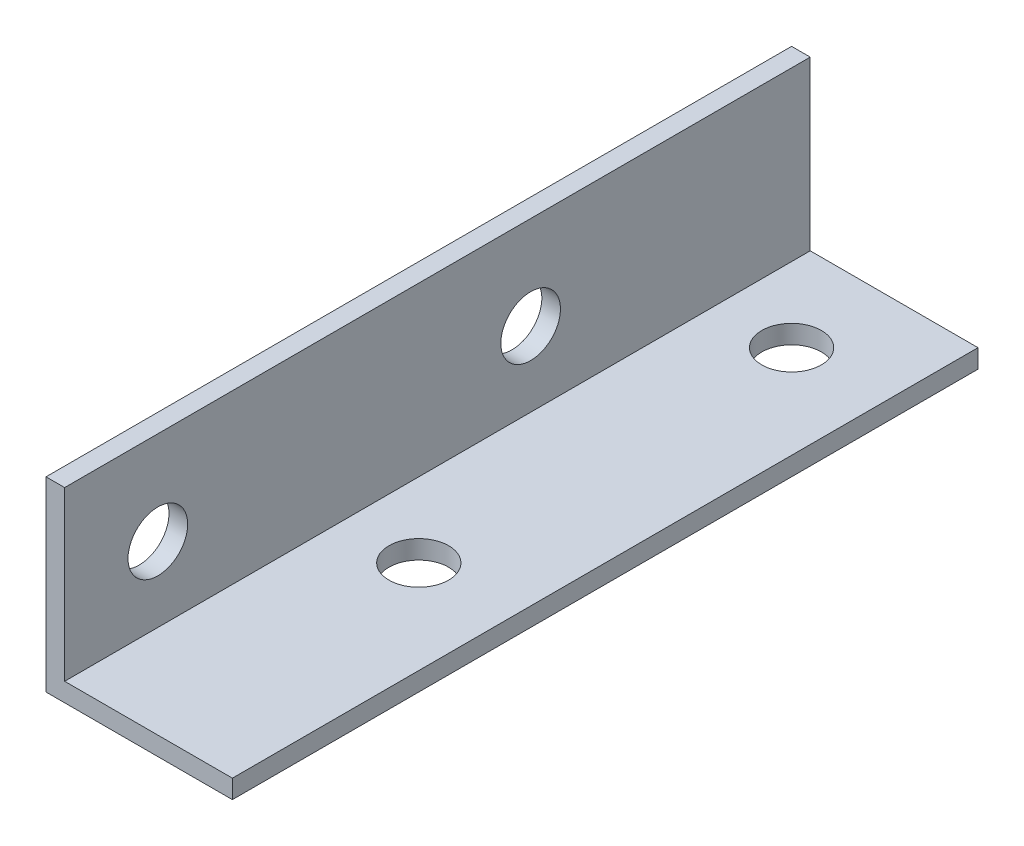
ISO-10303-21;
HEADER;
FILE_DESCRIPTION(('STEP AP214'),'2;1');
FILE_NAME('part.step','',(''),(''),'','','');
FILE_SCHEMA(('AUTOMOTIVE_DESIGN { 1 0 10303 214 1 1 1 1 }'));
ENDSEC;
DATA;
#1=APPLICATION_CONTEXT('core data for automotive mechanical design processes');
#2=APPLICATION_PROTOCOL_DEFINITION('international standard','automotive_design',2000,#1);
#3=PRODUCT_CONTEXT('',#1,'mechanical');
#4=PRODUCT('Part','Part','',(#3));
#5=PRODUCT_RELATED_PRODUCT_CATEGORY('part','',(#4));
#6=PRODUCT_DEFINITION_FORMATION('','',#4);
#7=PRODUCT_DEFINITION_CONTEXT('part definition',#1,'design');
#8=PRODUCT_DEFINITION('design','',#6,#7);
#9=PRODUCT_DEFINITION_SHAPE('','',#8);
#10=(LENGTH_UNIT() NAMED_UNIT(*) SI_UNIT(.MILLI.,.METRE.));
#11=(NAMED_UNIT(*) PLANE_ANGLE_UNIT() SI_UNIT($,.RADIAN.));
#12=(NAMED_UNIT(*) SI_UNIT($,.STERADIAN.) SOLID_ANGLE_UNIT());
#13=UNCERTAINTY_MEASURE_WITH_UNIT(LENGTH_MEASURE(1.E-05),#10,'distance_accuracy_value','');
#14=(GEOMETRIC_REPRESENTATION_CONTEXT(3) GLOBAL_UNCERTAINTY_ASSIGNED_CONTEXT((#13)) GLOBAL_UNIT_ASSIGNED_CONTEXT((#10,
#11,#12)) REPRESENTATION_CONTEXT('',''));
#15=CARTESIAN_POINT('',(0.,0.,0.));
#16=DIRECTION('',(0.,0.,1.));
#17=DIRECTION('',(1.,0.,0.));
#18=AXIS2_PLACEMENT_3D('',#15,#16,#17);
#19=CARTESIAN_POINT('',(-5.,-5.,40.));
#20=DIRECTION('',(1.,0.,0.));
#21=DIRECTION('',(0.,0.,-1.));
#22=AXIS2_PLACEMENT_3D('',#19,#20,#21);
#23=PLANE('',#22);
#24=CARTESIAN_POINT('',(-5.,0.,15.));
#25=DIRECTION('',(-1.,0.,0.));
#26=DIRECTION('',(0.,0.,1.));
#27=AXIS2_PLACEMENT_3D('',#24,#25,#26);
#28=CIRCLE('',#27,1.6);
#29=CARTESIAN_POINT('',(-5.,0.,16.6));
#30=VERTEX_POINT('',#29);
#31=EDGE_CURVE('E144',#30,#30,#28,.T.);
#32=ORIENTED_EDGE('',*,*,#31,.F.);
#33=EDGE_LOOP('',(#32));
#34=FACE_BOUND('',#33,.T.);
#35=CARTESIAN_POINT('',(-5.,0.,35.));
#36=DIRECTION('',(-1.,0.,0.));
#37=DIRECTION('',(0.,0.,1.));
#38=AXIS2_PLACEMENT_3D('',#35,#36,#37);
#39=CIRCLE('',#38,1.6);
#40=CARTESIAN_POINT('',(-5.,0.,36.6));
#41=VERTEX_POINT('',#40);
#42=EDGE_CURVE('E149',#41,#41,#39,.T.);
#43=ORIENTED_EDGE('',*,*,#42,.F.);
#44=EDGE_LOOP('',(#43));
#45=FACE_BOUND('',#44,.T.);
#46=DIRECTION('',(0.,-1.,0.));
#47=VECTOR('',#46,1.);
#48=CARTESIAN_POINT('',(-5.,-5.,0.));
#49=LINE('',#48,#47);
#50=CARTESIAN_POINT('',(-5.,5.,0.));
#51=VERTEX_POINT('',#50);
#52=CARTESIAN_POINT('',(-5.,-5.,0.));
#53=VERTEX_POINT('',#52);
#54=EDGE_CURVE('E119',#51,#53,#49,.T.);
#55=ORIENTED_EDGE('',*,*,#54,.T.);
#56=DIRECTION('',(0.,0.,-1.));
#57=VECTOR('',#56,1.);
#58=CARTESIAN_POINT('',(-5.,-5.,40.));
#59=LINE('',#58,#57);
#60=CARTESIAN_POINT('',(-5.,-5.,40.));
#61=VERTEX_POINT('',#60);
#62=EDGE_CURVE('E11',#61,#53,#59,.T.);
#63=ORIENTED_EDGE('',*,*,#62,.F.);
#64=DIRECTION('',(0.,-1.,0.));
#65=VECTOR('',#64,1.);
#66=CARTESIAN_POINT('',(-5.,-5.,40.));
#67=LINE('',#66,#65);
#68=CARTESIAN_POINT('',(-5.,5.,40.));
#69=VERTEX_POINT('',#68);
#70=EDGE_CURVE('E130',#69,#61,#67,.T.);
#71=ORIENTED_EDGE('',*,*,#70,.F.);
#72=DIRECTION('',(0.,0.,-1.));
#73=VECTOR('',#72,1.);
#74=CARTESIAN_POINT('',(-5.,5.,40.));
#75=LINE('',#74,#73);
#76=EDGE_CURVE('E115',#69,#51,#75,.T.);
#77=ORIENTED_EDGE('',*,*,#76,.T.);
#78=EDGE_LOOP('',(#55,#63,#71,#77));
#79=FACE_BOUND('',#78,.T.);
#80=ADVANCED_FACE('F33',(#34,#45,#79),#23,.F.);
#81=CARTESIAN_POINT('',(5.,-5.,40.));
#82=DIRECTION('',(0.,1.,0.));
#83=DIRECTION('',(-1.,0.,0.));
#84=AXIS2_PLACEMENT_3D('',#81,#82,#83);
#85=PLANE('',#84);
#86=CARTESIAN_POINT('',(0.,-5.,5.));
#87=DIRECTION('',(0.,1.,0.));
#88=DIRECTION('',(-1.,0.,0.));
#89=AXIS2_PLACEMENT_3D('',#86,#87,#88);
#90=CIRCLE('',#89,1.6);
#91=CARTESIAN_POINT('',(-1.6,-5.,5.));
#92=VERTEX_POINT('',#91);
#93=EDGE_CURVE('E123',#92,#92,#90,.T.);
#94=ORIENTED_EDGE('',*,*,#93,.T.);
#95=EDGE_LOOP('',(#94));
#96=FACE_BOUND('',#95,.T.);
#97=CARTESIAN_POINT('',(0.,-5.,25.));
#98=DIRECTION('',(0.,1.,0.));
#99=DIRECTION('',(-1.,0.,0.));
#100=AXIS2_PLACEMENT_3D('',#97,#98,#99);
#101=CIRCLE('',#100,1.6);
#102=CARTESIAN_POINT('',(-1.6,-5.,25.));
#103=VERTEX_POINT('',#102);
#104=EDGE_CURVE('E139',#103,#103,#101,.T.);
#105=ORIENTED_EDGE('',*,*,#104,.T.);
#106=EDGE_LOOP('',(#105));
#107=FACE_BOUND('',#106,.T.);
#108=DIRECTION('',(1.,0.,0.));
#109=VECTOR('',#108,1.);
#110=CARTESIAN_POINT('',(5.,-5.,0.));
#111=LINE('',#110,#109);
#112=CARTESIAN_POINT('',(5.,-5.,0.));
#113=VERTEX_POINT('',#112);
#114=EDGE_CURVE('E122',#53,#113,#111,.T.);
#115=ORIENTED_EDGE('',*,*,#114,.T.);
#116=DIRECTION('',(0.,0.,-1.));
#117=VECTOR('',#116,1.);
#118=CARTESIAN_POINT('',(5.,-5.,40.));
#119=LINE('',#118,#117);
#120=CARTESIAN_POINT('',(5.,-5.,40.));
#121=VERTEX_POINT('',#120);
#122=EDGE_CURVE('E42',#121,#113,#119,.T.);
#123=ORIENTED_EDGE('',*,*,#122,.F.);
#124=DIRECTION('',(1.,0.,0.));
#125=VECTOR('',#124,1.);
#126=CARTESIAN_POINT('',(5.,-5.,40.));
#127=LINE('',#126,#125);
#128=EDGE_CURVE('E88',#61,#121,#127,.T.);
#129=ORIENTED_EDGE('',*,*,#128,.F.);
#130=ORIENTED_EDGE('',*,*,#62,.T.);
#131=EDGE_LOOP('',(#115,#123,#129,#130));
#132=FACE_BOUND('',#131,.T.);
#133=ADVANCED_FACE('F163',(#96,#107,#132),#85,.F.);
#134=CARTESIAN_POINT('',(5.,-5.,40.));
#135=DIRECTION('',(-1.,0.,0.));
#136=DIRECTION('',(0.,0.,1.));
#137=AXIS2_PLACEMENT_3D('',#134,#135,#136);
#138=PLANE('',#137);
#139=DIRECTION('',(0.,1.,0.));
#140=VECTOR('',#139,1.);
#141=CARTESIAN_POINT('',(5.,-5.,0.));
#142=LINE('',#141,#140);
#143=CARTESIAN_POINT('',(5.,-4.,0.));
#144=VERTEX_POINT('',#143);
#145=EDGE_CURVE('E125',#113,#144,#142,.T.);
#146=ORIENTED_EDGE('',*,*,#145,.T.);
#147=DIRECTION('',(0.,0.,-1.));
#148=VECTOR('',#147,1.);
#149=CARTESIAN_POINT('',(5.,-4.,40.));
#150=LINE('',#149,#148);
#151=CARTESIAN_POINT('',(5.,-4.,40.));
#152=VERTEX_POINT('',#151);
#153=EDGE_CURVE('E110',#152,#144,#150,.T.);
#154=ORIENTED_EDGE('',*,*,#153,.F.);
#155=DIRECTION('',(0.,1.,0.));
#156=VECTOR('',#155,1.);
#157=CARTESIAN_POINT('',(5.,-5.,40.));
#158=LINE('',#157,#156);
#159=EDGE_CURVE('E101',#121,#152,#158,.T.);
#160=ORIENTED_EDGE('',*,*,#159,.F.);
#161=ORIENTED_EDGE('',*,*,#122,.T.);
#162=EDGE_LOOP('',(#146,#154,#160,#161));
#163=FACE_BOUND('',#162,.T.);
#164=ADVANCED_FACE('F166',(#163),#138,.F.);
#165=CARTESIAN_POINT('',(-4.,-4.,40.));
#166=DIRECTION('',(0.,-1.,0.));
#167=DIRECTION('',(0.,0.,-1.));
#168=AXIS2_PLACEMENT_3D('',#165,#166,#167);
#169=PLANE('',#168);
#170=CARTESIAN_POINT('',(0.,-4.,5.));
#171=DIRECTION('',(0.,-1.,0.));
#172=DIRECTION('',(0.,0.,-1.));
#173=AXIS2_PLACEMENT_3D('',#170,#171,#172);
#174=CIRCLE('',#173,1.6);
#175=CARTESIAN_POINT('',(0.,-4.,3.4));
#176=VERTEX_POINT('',#175);
#177=EDGE_CURVE('E140',#176,#176,#174,.T.);
#178=ORIENTED_EDGE('',*,*,#177,.T.);
#179=EDGE_LOOP('',(#178));
#180=FACE_BOUND('',#179,.T.);
#181=CARTESIAN_POINT('',(0.,-4.,25.));
#182=DIRECTION('',(0.,-1.,0.));
#183=DIRECTION('',(0.,0.,-1.));
#184=AXIS2_PLACEMENT_3D('',#181,#182,#183);
#185=CIRCLE('',#184,1.6);
#186=CARTESIAN_POINT('',(0.,-4.,23.4));
#187=VERTEX_POINT('',#186);
#188=EDGE_CURVE('E136',#187,#187,#185,.T.);
#189=ORIENTED_EDGE('',*,*,#188,.T.);
#190=EDGE_LOOP('',(#189));
#191=FACE_BOUND('',#190,.T.);
#192=DIRECTION('',(-1.,0.,0.));
#193=VECTOR('',#192,1.);
#194=CARTESIAN_POINT('',(-4.,-4.,0.));
#195=LINE('',#194,#193);
#196=CARTESIAN_POINT('',(-4.,-4.,0.));
#197=VERTEX_POINT('',#196);
#198=EDGE_CURVE('E109',#144,#197,#195,.T.);
#199=ORIENTED_EDGE('',*,*,#198,.T.);
#200=DIRECTION('',(0.,0.,-1.));
#201=VECTOR('',#200,1.);
#202=CARTESIAN_POINT('',(-4.,-4.,40.));
#203=LINE('',#202,#201);
#204=CARTESIAN_POINT('',(-4.,-4.,40.));
#205=VERTEX_POINT('',#204);
#206=EDGE_CURVE('E106',#205,#197,#203,.T.);
#207=ORIENTED_EDGE('',*,*,#206,.F.);
#208=DIRECTION('',(-1.,0.,0.));
#209=VECTOR('',#208,1.);
#210=CARTESIAN_POINT('',(-4.,-4.,40.));
#211=LINE('',#210,#209);
#212=EDGE_CURVE('E95',#152,#205,#211,.T.);
#213=ORIENTED_EDGE('',*,*,#212,.F.);
#214=ORIENTED_EDGE('',*,*,#153,.T.);
#215=EDGE_LOOP('',(#199,#207,#213,#214));
#216=FACE_BOUND('',#215,.T.);
#217=ADVANCED_FACE('F107',(#180,#191,#216),#169,.F.);
#218=CARTESIAN_POINT('',(-4.,5.,40.));
#219=DIRECTION('',(-1.,0.,0.));
#220=DIRECTION('',(0.,0.,1.));
#221=AXIS2_PLACEMENT_3D('',#218,#219,#220);
#222=PLANE('',#221);
#223=CARTESIAN_POINT('',(-4.,0.,15.));
#224=DIRECTION('',(-1.,0.,0.));
#225=DIRECTION('',(0.,0.,1.));
#226=AXIS2_PLACEMENT_3D('',#223,#224,#225);
#227=CIRCLE('',#226,1.6);
#228=CARTESIAN_POINT('',(-4.,0.,16.6));
#229=VERTEX_POINT('',#228);
#230=EDGE_CURVE('E36',#229,#229,#227,.T.);
#231=ORIENTED_EDGE('',*,*,#230,.T.);
#232=EDGE_LOOP('',(#231));
#233=FACE_BOUND('',#232,.T.);
#234=CARTESIAN_POINT('',(-4.,0.,35.));
#235=DIRECTION('',(-1.,0.,0.));
#236=DIRECTION('',(0.,0.,1.));
#237=AXIS2_PLACEMENT_3D('',#234,#235,#236);
#238=CIRCLE('',#237,1.6);
#239=CARTESIAN_POINT('',(-4.,0.,36.6));
#240=VERTEX_POINT('',#239);
#241=EDGE_CURVE('E142',#240,#240,#238,.T.);
#242=ORIENTED_EDGE('',*,*,#241,.T.);
#243=EDGE_LOOP('',(#242));
#244=FACE_BOUND('',#243,.T.);
#245=DIRECTION('',(0.,1.,0.));
#246=VECTOR('',#245,1.);
#247=CARTESIAN_POINT('',(-4.,5.,0.));
#248=LINE('',#247,#246);
#249=CARTESIAN_POINT('',(-4.,5.,0.));
#250=VERTEX_POINT('',#249);
#251=EDGE_CURVE('E74',#197,#250,#248,.T.);
#252=ORIENTED_EDGE('',*,*,#251,.T.);
#253=DIRECTION('',(0.,0.,-1.));
#254=VECTOR('',#253,1.);
#255=CARTESIAN_POINT('',(-4.,5.,40.));
#256=LINE('',#255,#254);
#257=CARTESIAN_POINT('',(-4.,5.,40.));
#258=VERTEX_POINT('',#257);
#259=EDGE_CURVE('E111',#258,#250,#256,.T.);
#260=ORIENTED_EDGE('',*,*,#259,.F.);
#261=DIRECTION('',(0.,1.,0.));
#262=VECTOR('',#261,1.);
#263=CARTESIAN_POINT('',(-4.,5.,40.));
#264=LINE('',#263,#262);
#265=EDGE_CURVE('E99',#205,#258,#264,.T.);
#266=ORIENTED_EDGE('',*,*,#265,.F.);
#267=ORIENTED_EDGE('',*,*,#206,.T.);
#268=EDGE_LOOP('',(#252,#260,#266,#267));
#269=FACE_BOUND('',#268,.T.);
#270=ADVANCED_FACE('F113',(#233,#244,#269),#222,.F.);
#271=CARTESIAN_POINT('',(-4.,5.,40.));
#272=DIRECTION('',(0.,-1.,0.));
#273=DIRECTION('',(0.,0.,-1.));
#274=AXIS2_PLACEMENT_3D('',#271,#272,#273);
#275=PLANE('',#274);
#276=DIRECTION('',(-1.,0.,0.));
#277=VECTOR('',#276,1.);
#278=CARTESIAN_POINT('',(-4.,5.,0.));
#279=LINE('',#278,#277);
#280=EDGE_CURVE('E80',#250,#51,#279,.T.);
#281=ORIENTED_EDGE('',*,*,#280,.T.);
#282=ORIENTED_EDGE('',*,*,#76,.F.);
#283=DIRECTION('',(-1.,0.,0.));
#284=VECTOR('',#283,1.);
#285=CARTESIAN_POINT('',(-4.,5.,40.));
#286=LINE('',#285,#284);
#287=EDGE_CURVE('E51',#258,#69,#286,.T.);
#288=ORIENTED_EDGE('',*,*,#287,.F.);
#289=ORIENTED_EDGE('',*,*,#259,.T.);
#290=EDGE_LOOP('',(#281,#282,#288,#289));
#291=FACE_BOUND('',#290,.T.);
#292=ADVANCED_FACE('F171',(#291),#275,.F.);
#293=CARTESIAN_POINT('',(0.,0.,40.));
#294=DIRECTION('',(0.,0.,1.));
#295=DIRECTION('',(1.,0.,0.));
#296=AXIS2_PLACEMENT_3D('',#293,#294,#295);
#297=PLANE('',#296);
#298=ORIENTED_EDGE('',*,*,#70,.T.);
#299=ORIENTED_EDGE('',*,*,#128,.T.);
#300=ORIENTED_EDGE('',*,*,#159,.T.);
#301=ORIENTED_EDGE('',*,*,#212,.T.);
#302=ORIENTED_EDGE('',*,*,#265,.T.);
#303=ORIENTED_EDGE('',*,*,#287,.T.);
#304=EDGE_LOOP('',(#298,#299,#300,#301,#302,#303));
#305=FACE_BOUND('',#304,.T.);
#306=ADVANCED_FACE('F97',(#305),#297,.T.);
#307=CARTESIAN_POINT('',(0.,0.,0.));
#308=DIRECTION('',(0.,0.,1.));
#309=DIRECTION('',(1.,0.,0.));
#310=AXIS2_PLACEMENT_3D('',#307,#308,#309);
#311=PLANE('',#310);
#312=ORIENTED_EDGE('',*,*,#54,.F.);
#313=ORIENTED_EDGE('',*,*,#280,.F.);
#314=ORIENTED_EDGE('',*,*,#251,.F.);
#315=ORIENTED_EDGE('',*,*,#198,.F.);
#316=ORIENTED_EDGE('',*,*,#145,.F.);
#317=ORIENTED_EDGE('',*,*,#114,.F.);
#318=EDGE_LOOP('',(#312,#313,#314,#315,#316,#317));
#319=FACE_BOUND('',#318,.T.);
#320=ADVANCED_FACE('F169',(#319),#311,.F.);
#321=CARTESIAN_POINT('',(0.,5.,25.));
#322=DIRECTION('',(0.,-1.,0.));
#323=DIRECTION('',(1.,0.,0.));
#324=AXIS2_PLACEMENT_3D('',#321,#322,#323);
#325=CYLINDRICAL_SURFACE('',#324,1.6);
#326=ORIENTED_EDGE('',*,*,#188,.F.);
#327=EDGE_LOOP('',(#326));
#328=FACE_BOUND('',#327,.T.);
#329=ORIENTED_EDGE('',*,*,#104,.F.);
#330=EDGE_LOOP('',(#329));
#331=FACE_BOUND('',#330,.T.);
#332=ADVANCED_FACE('F202',(#328,#331),#325,.F.);
#333=CARTESIAN_POINT('',(0.,5.,5.));
#334=DIRECTION('',(0.,-1.,0.));
#335=DIRECTION('',(1.,0.,0.));
#336=AXIS2_PLACEMENT_3D('',#333,#334,#335);
#337=CYLINDRICAL_SURFACE('',#336,1.6);
#338=ORIENTED_EDGE('',*,*,#177,.F.);
#339=EDGE_LOOP('',(#338));
#340=FACE_BOUND('',#339,.T.);
#341=ORIENTED_EDGE('',*,*,#93,.F.);
#342=EDGE_LOOP('',(#341));
#343=FACE_BOUND('',#342,.T.);
#344=ADVANCED_FACE('F195',(#340,#343),#337,.F.);
#345=CARTESIAN_POINT('',(5.,0.,35.));
#346=DIRECTION('',(-1.,0.,0.));
#347=DIRECTION('',(0.,0.,1.));
#348=AXIS2_PLACEMENT_3D('',#345,#346,#347);
#349=CYLINDRICAL_SURFACE('',#348,1.6);
#350=ORIENTED_EDGE('',*,*,#42,.T.);
#351=EDGE_LOOP('',(#350));
#352=FACE_BOUND('',#351,.T.);
#353=ORIENTED_EDGE('',*,*,#241,.F.);
#354=EDGE_LOOP('',(#353));
#355=FACE_BOUND('',#354,.T.);
#356=ADVANCED_FACE('F191',(#352,#355),#349,.F.);
#357=CARTESIAN_POINT('',(5.,0.,15.));
#358=DIRECTION('',(-1.,0.,0.));
#359=DIRECTION('',(0.,0.,1.));
#360=AXIS2_PLACEMENT_3D('',#357,#358,#359);
#361=CYLINDRICAL_SURFACE('',#360,1.6);
#362=ORIENTED_EDGE('',*,*,#31,.T.);
#363=EDGE_LOOP('',(#362));
#364=FACE_BOUND('',#363,.T.);
#365=ORIENTED_EDGE('',*,*,#230,.F.);
#366=EDGE_LOOP('',(#365));
#367=FACE_BOUND('',#366,.T.);
#368=ADVANCED_FACE('F194',(#364,#367),#361,.F.);
#369=CLOSED_SHELL('',(#80,#133,#164,#217,#270,#292,#306,#320,#332,#344,#356,#368));
#370=MANIFOLD_SOLID_BREP('B2',#369);
#371=ADVANCED_BREP_SHAPE_REPRESENTATION('',(#18,#370),#14);
#372=SHAPE_DEFINITION_REPRESENTATION(#9,#371);
ENDSEC;
END-ISO-10303-21;
